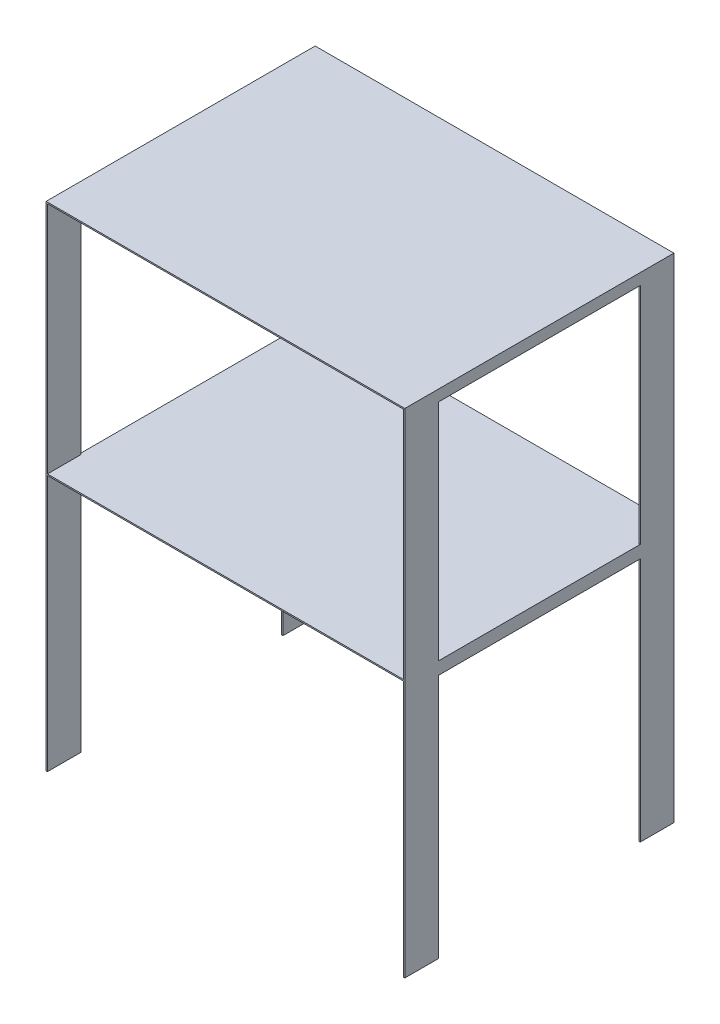
ISO-10303-21;
HEADER;
FILE_DESCRIPTION(('STEP AP214'),'2;1');
FILE_NAME('part.step','',(''),(''),'','','');
FILE_SCHEMA(('AUTOMOTIVE_DESIGN { 1 0 10303 214 1 1 1 1 }'));
ENDSEC;
DATA;
#1=APPLICATION_CONTEXT('core data for automotive mechanical design processes');
#2=APPLICATION_PROTOCOL_DEFINITION('international standard','automotive_design',2000,#1);
#3=PRODUCT_CONTEXT('',#1,'mechanical');
#4=PRODUCT('Part','Part','',(#3));
#5=PRODUCT_RELATED_PRODUCT_CATEGORY('part','',(#4));
#6=PRODUCT_DEFINITION_FORMATION('','',#4);
#7=PRODUCT_DEFINITION_CONTEXT('part definition',#1,'design');
#8=PRODUCT_DEFINITION('design','',#6,#7);
#9=PRODUCT_DEFINITION_SHAPE('','',#8);
#10=(LENGTH_UNIT() NAMED_UNIT(*) SI_UNIT(.MILLI.,.METRE.));
#11=(NAMED_UNIT(*) PLANE_ANGLE_UNIT() SI_UNIT($,.RADIAN.));
#12=(NAMED_UNIT(*) SI_UNIT($,.STERADIAN.) SOLID_ANGLE_UNIT());
#13=UNCERTAINTY_MEASURE_WITH_UNIT(LENGTH_MEASURE(1.E-05),#10,'distance_accuracy_value','');
#14=(GEOMETRIC_REPRESENTATION_CONTEXT(3) GLOBAL_UNCERTAINTY_ASSIGNED_CONTEXT((#13)) GLOBAL_UNIT_ASSIGNED_CONTEXT((#10,
#11,#12)) REPRESENTATION_CONTEXT('',''));
#15=CARTESIAN_POINT('',(0.,0.,0.));
#16=DIRECTION('',(0.,0.,1.));
#17=DIRECTION('',(1.,0.,0.));
#18=AXIS2_PLACEMENT_3D('',#15,#16,#17);
#19=CARTESIAN_POINT('',(-160.,440.,-120.));
#20=DIRECTION('',(0.,0.,1.));
#21=DIRECTION('',(1.,0.,0.));
#22=AXIS2_PLACEMENT_3D('',#19,#20,#21);
#23=PLANE('',#22);
#24=DIRECTION('',(-1.,0.,0.));
#25=VECTOR('',#24,1.);
#26=CARTESIAN_POINT('',(158.8,440.,-120.));
#27=LINE('',#26,#25);
#28=CARTESIAN_POINT('',(158.8,440.,-120.));
#29=VERTEX_POINT('',#28);
#30=CARTESIAN_POINT('',(-158.8,440.,-120.));
#31=VERTEX_POINT('',#30);
#32=EDGE_CURVE('E467',#29,#31,#27,.T.);
#33=ORIENTED_EDGE('',*,*,#32,.T.);
#34=DIRECTION('',(0.,-1.,0.));
#35=VECTOR('',#34,1.);
#36=CARTESIAN_POINT('',(-158.8,431.2,-120.));
#37=LINE('',#36,#35);
#38=CARTESIAN_POINT('',(-158.8,231.2,-120.));
#39=VERTEX_POINT('',#38);
#40=EDGE_CURVE('E388',#31,#39,#37,.T.);
#41=ORIENTED_EDGE('',*,*,#40,.T.);
#42=DIRECTION('',(1.,0.,0.));
#43=VECTOR('',#42,1.);
#44=CARTESIAN_POINT('',(-158.8,231.2,-120.));
#45=LINE('',#44,#43);
#46=CARTESIAN_POINT('',(158.8,231.2,-120.));
#47=VERTEX_POINT('',#46);
#48=EDGE_CURVE('E357',#39,#47,#45,.T.);
#49=ORIENTED_EDGE('',*,*,#48,.T.);
#50=DIRECTION('',(0.,-1.,0.));
#51=VECTOR('',#50,1.);
#52=CARTESIAN_POINT('',(158.8,431.2,-120.));
#53=LINE('',#52,#51);
#54=EDGE_CURVE('E385',#29,#47,#53,.T.);
#55=ORIENTED_EDGE('',*,*,#54,.F.);
#56=EDGE_LOOP('',(#33,#41,#49,#55));
#57=FACE_BOUND('',#56,.T.);
#58=DIRECTION('',(1.,0.,0.));
#59=VECTOR('',#58,1.);
#60=CARTESIAN_POINT('',(-160.,1.19999999999998,-120.));
#61=LINE('',#60,#59);
#62=CARTESIAN_POINT('',(-160.,1.19999999999998,-120.));
#63=VERTEX_POINT('',#62);
#64=CARTESIAN_POINT('',(-158.8,1.20000000000001,-120.));
#65=VERTEX_POINT('',#64);
#66=EDGE_CURVE('E455',#63,#65,#61,.T.);
#67=ORIENTED_EDGE('',*,*,#66,.F.);
#68=DIRECTION('',(0.,-1.,0.));
#69=VECTOR('',#68,1.);
#70=CARTESIAN_POINT('',(-160.,440.,-120.));
#71=LINE('',#70,#69);
#72=CARTESIAN_POINT('',(-160.,441.2,-120.));
#73=VERTEX_POINT('',#72);
#74=EDGE_CURVE('E285',#73,#63,#71,.T.);
#75=ORIENTED_EDGE('',*,*,#74,.F.);
#76=DIRECTION('',(-1.,0.,0.));
#77=VECTOR('',#76,1.);
#78=CARTESIAN_POINT('',(-160.,441.2,-120.));
#79=LINE('',#78,#77);
#80=CARTESIAN_POINT('',(160.,441.2,-120.));
#81=VERTEX_POINT('',#80);
#82=EDGE_CURVE('E418',#81,#73,#79,.T.);
#83=ORIENTED_EDGE('',*,*,#82,.F.);
#84=DIRECTION('',(0.,-1.,0.));
#85=VECTOR('',#84,1.);
#86=CARTESIAN_POINT('',(160.,440.,-120.));
#87=LINE('',#86,#85);
#88=CARTESIAN_POINT('',(160.,1.19999999999998,-120.));
#89=VERTEX_POINT('',#88);
#90=EDGE_CURVE('E288',#81,#89,#87,.T.);
#91=ORIENTED_EDGE('',*,*,#90,.T.);
#92=CARTESIAN_POINT('',(158.8,1.20000000000001,-120.));
#93=VERTEX_POINT('',#92);
#94=EDGE_CURVE('E458',#93,#89,#61,.T.);
#95=ORIENTED_EDGE('',*,*,#94,.F.);
#96=DIRECTION('',(0.,-1.,0.));
#97=VECTOR('',#96,1.);
#98=CARTESIAN_POINT('',(158.8,220.,-120.));
#99=LINE('',#98,#97);
#100=CARTESIAN_POINT('',(158.8,230.,-120.));
#101=VERTEX_POINT('',#100);
#102=EDGE_CURVE('E261',#101,#93,#99,.T.);
#103=ORIENTED_EDGE('',*,*,#102,.F.);
#104=DIRECTION('',(1.,0.,0.));
#105=VECTOR('',#104,1.);
#106=CARTESIAN_POINT('',(158.8,230.,-120.));
#107=LINE('',#106,#105);
#108=CARTESIAN_POINT('',(-158.8,230.,-120.));
#109=VERTEX_POINT('',#108);
#110=EDGE_CURVE('E406',#109,#101,#107,.T.);
#111=ORIENTED_EDGE('',*,*,#110,.F.);
#112=DIRECTION('',(0.,-1.,0.));
#113=VECTOR('',#112,1.);
#114=CARTESIAN_POINT('',(-158.8,220.,-120.));
#115=LINE('',#114,#113);
#116=EDGE_CURVE('E258',#109,#65,#115,.T.);
#117=ORIENTED_EDGE('',*,*,#116,.T.);
#118=EDGE_LOOP('',(#67,#75,#83,#91,#95,#103,#111,#117));
#119=FACE_BOUND('',#118,.T.);
#120=ADVANCED_FACE('F41',(#57,#119),#23,.F.);
#121=CARTESIAN_POINT('',(-160.,440.,120.));
#122=DIRECTION('',(0.,0.,-1.));
#123=DIRECTION('',(-1.,0.,0.));
#124=AXIS2_PLACEMENT_3D('',#121,#122,#123);
#125=PLANE('',#124);
#126=DIRECTION('',(0.,-1.,0.));
#127=VECTOR('',#126,1.);
#128=CARTESIAN_POINT('',(-158.8,431.2,120.));
#129=LINE('',#128,#127);
#130=CARTESIAN_POINT('',(-158.8,440.,120.));
#131=VERTEX_POINT('',#130);
#132=CARTESIAN_POINT('',(-158.8,231.2,120.));
#133=VERTEX_POINT('',#132);
#134=EDGE_CURVE('E318',#131,#133,#129,.T.);
#135=ORIENTED_EDGE('',*,*,#134,.F.);
#136=DIRECTION('',(1.,0.,0.));
#137=VECTOR('',#136,1.);
#138=CARTESIAN_POINT('',(-158.8,440.,120.));
#139=LINE('',#138,#137);
#140=CARTESIAN_POINT('',(158.8,440.,120.));
#141=VERTEX_POINT('',#140);
#142=EDGE_CURVE('E472',#131,#141,#139,.T.);
#143=ORIENTED_EDGE('',*,*,#142,.T.);
#144=DIRECTION('',(0.,-1.,0.));
#145=VECTOR('',#144,1.);
#146=CARTESIAN_POINT('',(158.8,431.2,120.));
#147=LINE('',#146,#145);
#148=CARTESIAN_POINT('',(158.8,231.2,120.));
#149=VERTEX_POINT('',#148);
#150=EDGE_CURVE('E371',#141,#149,#147,.T.);
#151=ORIENTED_EDGE('',*,*,#150,.T.);
#152=DIRECTION('',(-1.,0.,0.));
#153=VECTOR('',#152,1.);
#154=CARTESIAN_POINT('',(158.8,231.2,120.));
#155=LINE('',#154,#153);
#156=EDGE_CURVE('E343',#149,#133,#155,.T.);
#157=ORIENTED_EDGE('',*,*,#156,.T.);
#158=EDGE_LOOP('',(#135,#143,#151,#157));
#159=FACE_BOUND('',#158,.T.);
#160=DIRECTION('',(-1.,0.,0.));
#161=VECTOR('',#160,1.);
#162=CARTESIAN_POINT('',(-160.,1.19999999999998,120.));
#163=LINE('',#162,#161);
#164=CARTESIAN_POINT('',(160.,1.19999999999998,120.));
#165=VERTEX_POINT('',#164);
#166=CARTESIAN_POINT('',(158.8,1.20000000000001,120.));
#167=VERTEX_POINT('',#166);
#168=EDGE_CURVE('E452',#165,#167,#163,.T.);
#169=ORIENTED_EDGE('',*,*,#168,.F.);
#170=DIRECTION('',(0.,-1.,0.));
#171=VECTOR('',#170,1.);
#172=CARTESIAN_POINT('',(160.,440.,120.));
#173=LINE('',#172,#171);
#174=CARTESIAN_POINT('',(160.,441.2,120.));
#175=VERTEX_POINT('',#174);
#176=EDGE_CURVE('E279',#175,#165,#173,.T.);
#177=ORIENTED_EDGE('',*,*,#176,.F.);
#178=DIRECTION('',(1.,0.,0.));
#179=VECTOR('',#178,1.);
#180=CARTESIAN_POINT('',(-160.,441.2,120.));
#181=LINE('',#180,#179);
#182=CARTESIAN_POINT('',(-160.,441.2,120.));
#183=VERTEX_POINT('',#182);
#184=EDGE_CURVE('E412',#183,#175,#181,.T.);
#185=ORIENTED_EDGE('',*,*,#184,.F.);
#186=DIRECTION('',(0.,-1.,0.));
#187=VECTOR('',#186,1.);
#188=CARTESIAN_POINT('',(-160.,440.,120.));
#189=LINE('',#188,#187);
#190=CARTESIAN_POINT('',(-160.,1.19999999999998,120.));
#191=VERTEX_POINT('',#190);
#192=EDGE_CURVE('E282',#183,#191,#189,.T.);
#193=ORIENTED_EDGE('',*,*,#192,.T.);
#194=CARTESIAN_POINT('',(-158.8,1.20000000000001,120.));
#195=VERTEX_POINT('',#194);
#196=EDGE_CURVE('E448',#195,#191,#163,.T.);
#197=ORIENTED_EDGE('',*,*,#196,.F.);
#198=DIRECTION('',(0.,-1.,0.));
#199=VECTOR('',#198,1.);
#200=CARTESIAN_POINT('',(-158.8,220.,120.));
#201=LINE('',#200,#199);
#202=CARTESIAN_POINT('',(-158.8,230.,120.));
#203=VERTEX_POINT('',#202);
#204=EDGE_CURVE('E239',#203,#195,#201,.T.);
#205=ORIENTED_EDGE('',*,*,#204,.F.);
#206=DIRECTION('',(-1.,0.,0.));
#207=VECTOR('',#206,1.);
#208=CARTESIAN_POINT('',(-158.8,230.,120.));
#209=LINE('',#208,#207);
#210=CARTESIAN_POINT('',(158.8,230.,120.));
#211=VERTEX_POINT('',#210);
#212=EDGE_CURVE('E400',#211,#203,#209,.T.);
#213=ORIENTED_EDGE('',*,*,#212,.F.);
#214=DIRECTION('',(0.,-1.,0.));
#215=VECTOR('',#214,1.);
#216=CARTESIAN_POINT('',(158.8,220.,120.));
#217=LINE('',#216,#215);
#218=EDGE_CURVE('E276',#211,#167,#217,.T.);
#219=ORIENTED_EDGE('',*,*,#218,.T.);
#220=EDGE_LOOP('',(#169,#177,#185,#193,#197,#205,#213,#219));
#221=FACE_BOUND('',#220,.T.);
#222=ADVANCED_FACE('F504',(#159,#221),#125,.F.);
#223=CARTESIAN_POINT('',(160.,440.,120.));
#224=DIRECTION('',(-1.,0.,0.));
#225=DIRECTION('',(0.,0.,1.));
#226=AXIS2_PLACEMENT_3D('',#223,#224,#225);
#227=PLANE('',#226);
#228=DIRECTION('',(0.,0.,1.));
#229=VECTOR('',#228,1.);
#230=CARTESIAN_POINT('',(160.,431.2,-90.));
#231=LINE('',#230,#229);
#232=CARTESIAN_POINT('',(160.,431.2,-90.));
#233=VERTEX_POINT('',#232);
#234=CARTESIAN_POINT('',(160.,431.2,90.));
#235=VERTEX_POINT('',#234);
#236=EDGE_CURVE('E337',#233,#235,#231,.T.);
#237=ORIENTED_EDGE('',*,*,#236,.F.);
#238=DIRECTION('',(0.,-1.,0.));
#239=VECTOR('',#238,1.);
#240=CARTESIAN_POINT('',(160.,431.2,-90.));
#241=LINE('',#240,#239);
#242=CARTESIAN_POINT('',(160.,231.2,-90.));
#243=VERTEX_POINT('',#242);
#244=EDGE_CURVE('E380',#233,#243,#241,.T.);
#245=ORIENTED_EDGE('',*,*,#244,.T.);
#246=DIRECTION('',(0.,0.,1.));
#247=VECTOR('',#246,1.);
#248=CARTESIAN_POINT('',(160.,231.2,-90.));
#249=LINE('',#248,#247);
#250=CARTESIAN_POINT('',(160.,231.2,90.));
#251=VERTEX_POINT('',#250);
#252=EDGE_CURVE('E366',#243,#251,#249,.T.);
#253=ORIENTED_EDGE('',*,*,#252,.T.);
#254=DIRECTION('',(0.,-1.,0.));
#255=VECTOR('',#254,1.);
#256=CARTESIAN_POINT('',(160.,431.2,90.));
#257=LINE('',#256,#255);
#258=EDGE_CURVE('E377',#235,#251,#257,.T.);
#259=ORIENTED_EDGE('',*,*,#258,.F.);
#260=EDGE_LOOP('',(#237,#245,#253,#259));
#261=FACE_BOUND('',#260,.T.);
#262=DIRECTION('',(0.,0.,1.));
#263=VECTOR('',#262,1.);
#264=CARTESIAN_POINT('',(160.,1.19999999999998,120.));
#265=LINE('',#264,#263);
#266=CARTESIAN_POINT('',(160.,1.20000000000001,-90.));
#267=VERTEX_POINT('',#266);
#268=EDGE_CURVE('E64',#89,#267,#265,.T.);
#269=ORIENTED_EDGE('',*,*,#268,.F.);
#270=ORIENTED_EDGE('',*,*,#90,.F.);
#271=DIRECTION('',(0.,0.,-1.));
#272=VECTOR('',#271,1.);
#273=CARTESIAN_POINT('',(160.,441.2,-120.));
#274=LINE('',#273,#272);
#275=EDGE_CURVE('E415',#175,#81,#274,.T.);
#276=ORIENTED_EDGE('',*,*,#275,.F.);
#277=ORIENTED_EDGE('',*,*,#176,.T.);
#278=CARTESIAN_POINT('',(160.,1.20000000000001,90.));
#279=VERTEX_POINT('',#278);
#280=EDGE_CURVE('E464',#279,#165,#265,.T.);
#281=ORIENTED_EDGE('',*,*,#280,.F.);
#282=DIRECTION('',(0.,-1.,0.));
#283=VECTOR('',#282,1.);
#284=CARTESIAN_POINT('',(160.,220.,90.));
#285=LINE('',#284,#283);
#286=CARTESIAN_POINT('',(160.,220.,90.));
#287=VERTEX_POINT('',#286);
#288=EDGE_CURVE('E270',#287,#279,#285,.T.);
#289=ORIENTED_EDGE('',*,*,#288,.F.);
#290=DIRECTION('',(0.,0.,-1.));
#291=VECTOR('',#290,1.);
#292=CARTESIAN_POINT('',(160.,220.,90.));
#293=LINE('',#292,#291);
#294=CARTESIAN_POINT('',(160.,220.,-90.));
#295=VERTEX_POINT('',#294);
#296=EDGE_CURVE('E423',#287,#295,#293,.T.);
#297=ORIENTED_EDGE('',*,*,#296,.T.);
#298=DIRECTION('',(0.,-1.,0.));
#299=VECTOR('',#298,1.);
#300=CARTESIAN_POINT('',(160.,220.,-90.));
#301=LINE('',#300,#299);
#302=EDGE_CURVE('E267',#295,#267,#301,.T.);
#303=ORIENTED_EDGE('',*,*,#302,.T.);
#304=EDGE_LOOP('',(#269,#270,#276,#277,#281,#289,#297,#303));
#305=FACE_BOUND('',#304,.T.);
#306=ADVANCED_FACE('F43',(#261,#305),#227,.F.);
#307=CARTESIAN_POINT('',(-160.,440.,120.));
#308=DIRECTION('',(1.,0.,0.));
#309=DIRECTION('',(0.,0.,-1.));
#310=AXIS2_PLACEMENT_3D('',#307,#308,#309);
#311=PLANE('',#310);
#312=DIRECTION('',(0.,0.,-1.));
#313=VECTOR('',#312,1.);
#314=CARTESIAN_POINT('',(-160.,431.2,90.));
#315=LINE('',#314,#313);
#316=CARTESIAN_POINT('',(-160.,431.2,90.));
#317=VERTEX_POINT('',#316);
#318=CARTESIAN_POINT('',(-160.,431.2,-90.));
#319=VERTEX_POINT('',#318);
#320=EDGE_CURVE('E322',#317,#319,#315,.T.);
#321=ORIENTED_EDGE('',*,*,#320,.F.);
#322=DIRECTION('',(0.,-1.,0.));
#323=VECTOR('',#322,1.);
#324=CARTESIAN_POINT('',(-160.,431.2,90.));
#325=LINE('',#324,#323);
#326=CARTESIAN_POINT('',(-160.,231.2,90.));
#327=VERTEX_POINT('',#326);
#328=EDGE_CURVE('E317',#317,#327,#325,.T.);
#329=ORIENTED_EDGE('',*,*,#328,.T.);
#330=DIRECTION('',(0.,0.,-1.));
#331=VECTOR('',#330,1.);
#332=CARTESIAN_POINT('',(-160.,231.2,90.));
#333=LINE('',#332,#331);
#334=CARTESIAN_POINT('',(-160.,231.2,-90.));
#335=VERTEX_POINT('',#334);
#336=EDGE_CURVE('E349',#327,#335,#333,.T.);
#337=ORIENTED_EDGE('',*,*,#336,.T.);
#338=DIRECTION('',(0.,-1.,0.));
#339=VECTOR('',#338,1.);
#340=CARTESIAN_POINT('',(-160.,431.2,-90.));
#341=LINE('',#340,#339);
#342=EDGE_CURVE('E393',#319,#335,#341,.T.);
#343=ORIENTED_EDGE('',*,*,#342,.F.);
#344=EDGE_LOOP('',(#321,#329,#337,#343));
#345=FACE_BOUND('',#344,.T.);
#346=DIRECTION('',(0.,0.,-1.));
#347=VECTOR('',#346,1.);
#348=CARTESIAN_POINT('',(-160.,1.19999999999998,120.));
#349=LINE('',#348,#347);
#350=CARTESIAN_POINT('',(-160.,1.20000000000001,90.));
#351=VERTEX_POINT('',#350);
#352=EDGE_CURVE('E229',#191,#351,#349,.T.);
#353=ORIENTED_EDGE('',*,*,#352,.F.);
#354=ORIENTED_EDGE('',*,*,#192,.F.);
#355=DIRECTION('',(0.,0.,1.));
#356=VECTOR('',#355,1.);
#357=CARTESIAN_POINT('',(-160.,441.2,-120.));
#358=LINE('',#357,#356);
#359=EDGE_CURVE('E409',#73,#183,#358,.T.);
#360=ORIENTED_EDGE('',*,*,#359,.F.);
#361=ORIENTED_EDGE('',*,*,#74,.T.);
#362=CARTESIAN_POINT('',(-160.,1.20000000000001,-90.));
#363=VERTEX_POINT('',#362);
#364=EDGE_CURVE('E450',#363,#63,#349,.T.);
#365=ORIENTED_EDGE('',*,*,#364,.F.);
#366=DIRECTION('',(0.,-1.,0.));
#367=VECTOR('',#366,1.);
#368=CARTESIAN_POINT('',(-160.,220.,-90.));
#369=LINE('',#368,#367);
#370=CARTESIAN_POINT('',(-160.,220.,-90.));
#371=VERTEX_POINT('',#370);
#372=EDGE_CURVE('E248',#371,#363,#369,.T.);
#373=ORIENTED_EDGE('',*,*,#372,.F.);
#374=DIRECTION('',(0.,0.,1.));
#375=VECTOR('',#374,1.);
#376=CARTESIAN_POINT('',(-160.,220.,90.));
#377=LINE('',#376,#375);
#378=CARTESIAN_POINT('',(-160.,220.,90.));
#379=VERTEX_POINT('',#378);
#380=EDGE_CURVE('E431',#371,#379,#377,.T.);
#381=ORIENTED_EDGE('',*,*,#380,.T.);
#382=DIRECTION('',(0.,-1.,0.));
#383=VECTOR('',#382,1.);
#384=CARTESIAN_POINT('',(-160.,220.,90.));
#385=LINE('',#384,#383);
#386=EDGE_CURVE('E246',#379,#351,#385,.T.);
#387=ORIENTED_EDGE('',*,*,#386,.T.);
#388=EDGE_LOOP('',(#353,#354,#360,#361,#365,#373,#381,#387));
#389=FACE_BOUND('',#388,.T.);
#390=ADVANCED_FACE('F436',(#345,#389),#311,.F.);
#391=CARTESIAN_POINT('',(158.8,220.,120.));
#392=DIRECTION('',(-1.,0.,0.));
#393=DIRECTION('',(0.,0.,1.));
#394=AXIS2_PLACEMENT_3D('',#391,#392,#393);
#395=PLANE('',#394);
#396=ORIENTED_EDGE('',*,*,#102,.T.);
#397=DIRECTION('',(0.,0.,1.));
#398=VECTOR('',#397,1.);
#399=CARTESIAN_POINT('',(158.8,1.20000000000001,120.));
#400=LINE('',#399,#398);
#401=CARTESIAN_POINT('',(158.8,1.20000000000001,-90.));
#402=VERTEX_POINT('',#401);
#403=EDGE_CURVE('E460',#93,#402,#400,.T.);
#404=ORIENTED_EDGE('',*,*,#403,.T.);
#405=DIRECTION('',(0.,-1.,0.));
#406=VECTOR('',#405,1.);
#407=CARTESIAN_POINT('',(158.8,220.,-90.));
#408=LINE('',#407,#406);
#409=CARTESIAN_POINT('',(158.8,220.,-90.));
#410=VERTEX_POINT('',#409);
#411=EDGE_CURVE('E264',#410,#402,#408,.T.);
#412=ORIENTED_EDGE('',*,*,#411,.F.);
#413=DIRECTION('',(0.,0.,-1.));
#414=VECTOR('',#413,1.);
#415=CARTESIAN_POINT('',(158.8,220.,0.));
#416=LINE('',#415,#414);
#417=CARTESIAN_POINT('',(158.8,220.,90.));
#418=VERTEX_POINT('',#417);
#419=EDGE_CURVE('E293',#418,#410,#416,.T.);
#420=ORIENTED_EDGE('',*,*,#419,.F.);
#421=DIRECTION('',(0.,-1.,0.));
#422=VECTOR('',#421,1.);
#423=CARTESIAN_POINT('',(158.8,220.,90.));
#424=LINE('',#423,#422);
#425=CARTESIAN_POINT('',(158.8,1.20000000000001,90.));
#426=VERTEX_POINT('',#425);
#427=EDGE_CURVE('E273',#418,#426,#424,.T.);
#428=ORIENTED_EDGE('',*,*,#427,.T.);
#429=EDGE_CURVE('E56',#426,#167,#400,.T.);
#430=ORIENTED_EDGE('',*,*,#429,.T.);
#431=ORIENTED_EDGE('',*,*,#218,.F.);
#432=DIRECTION('',(0.,0.,1.));
#433=VECTOR('',#432,1.);
#434=CARTESIAN_POINT('',(158.8,230.,120.));
#435=LINE('',#434,#433);
#436=EDGE_CURVE('E374',#101,#211,#435,.T.);
#437=ORIENTED_EDGE('',*,*,#436,.F.);
#438=EDGE_LOOP('',(#396,#404,#412,#420,#428,#430,#431,#437));
#439=FACE_BOUND('',#438,.T.);
#440=ADVANCED_FACE('F495',(#439),#395,.T.);
#441=CARTESIAN_POINT('',(158.8,220.,90.));
#442=DIRECTION('',(0.,0.,-1.));
#443=DIRECTION('',(-1.,0.,0.));
#444=AXIS2_PLACEMENT_3D('',#441,#442,#443);
#445=PLANE('',#444);
#446=ORIENTED_EDGE('',*,*,#288,.T.);
#447=DIRECTION('',(-1.,0.,0.));
#448=VECTOR('',#447,1.);
#449=CARTESIAN_POINT('',(158.8,1.20000000000001,90.));
#450=LINE('',#449,#448);
#451=EDGE_CURVE('E465',#279,#426,#450,.T.);
#452=ORIENTED_EDGE('',*,*,#451,.T.);
#453=ORIENTED_EDGE('',*,*,#427,.F.);
#454=DIRECTION('',(1.,0.,0.));
#455=VECTOR('',#454,1.);
#456=CARTESIAN_POINT('',(158.8,220.,90.));
#457=LINE('',#456,#455);
#458=EDGE_CURVE('E421',#418,#287,#457,.T.);
#459=ORIENTED_EDGE('',*,*,#458,.T.);
#460=EDGE_LOOP('',(#446,#452,#453,#459));
#461=FACE_BOUND('',#460,.T.);
#462=ADVANCED_FACE('F501',(#461),#445,.T.);
#463=CARTESIAN_POINT('',(160.,220.,-90.));
#464=DIRECTION('',(0.,0.,1.));
#465=DIRECTION('',(1.,0.,0.));
#466=AXIS2_PLACEMENT_3D('',#463,#464,#465);
#467=PLANE('',#466);
#468=ORIENTED_EDGE('',*,*,#411,.T.);
#469=DIRECTION('',(1.,0.,0.));
#470=VECTOR('',#469,1.);
#471=CARTESIAN_POINT('',(160.,1.20000000000001,-90.));
#472=LINE('',#471,#470);
#473=EDGE_CURVE('E457',#402,#267,#472,.T.);
#474=ORIENTED_EDGE('',*,*,#473,.T.);
#475=ORIENTED_EDGE('',*,*,#302,.F.);
#476=DIRECTION('',(-1.,0.,0.));
#477=VECTOR('',#476,1.);
#478=CARTESIAN_POINT('',(160.,220.,-90.));
#479=LINE('',#478,#477);
#480=EDGE_CURVE('E426',#295,#410,#479,.T.);
#481=ORIENTED_EDGE('',*,*,#480,.T.);
#482=EDGE_LOOP('',(#468,#474,#475,#481));
#483=FACE_BOUND('',#482,.T.);
#484=ADVANCED_FACE('F517',(#483),#467,.T.);
#485=CARTESIAN_POINT('',(-158.8,220.,-90.));
#486=DIRECTION('',(1.,0.,0.));
#487=DIRECTION('',(0.,0.,-1.));
#488=AXIS2_PLACEMENT_3D('',#485,#486,#487);
#489=PLANE('',#488);
#490=ORIENTED_EDGE('',*,*,#204,.T.);
#491=DIRECTION('',(0.,0.,-1.));
#492=VECTOR('',#491,1.);
#493=CARTESIAN_POINT('',(-158.8,1.20000000000001,-90.));
#494=LINE('',#493,#492);
#495=CARTESIAN_POINT('',(-158.8,1.20000000000001,90.));
#496=VERTEX_POINT('',#495);
#497=EDGE_CURVE('E226',#195,#496,#494,.T.);
#498=ORIENTED_EDGE('',*,*,#497,.T.);
#499=DIRECTION('',(0.,-1.,0.));
#500=VECTOR('',#499,1.);
#501=CARTESIAN_POINT('',(-158.8,220.,90.));
#502=LINE('',#501,#500);
#503=CARTESIAN_POINT('',(-158.8,220.,90.));
#504=VERTEX_POINT('',#503);
#505=EDGE_CURVE('E237',#504,#496,#502,.T.);
#506=ORIENTED_EDGE('',*,*,#505,.F.);
#507=DIRECTION('',(0.,0.,1.));
#508=VECTOR('',#507,1.);
#509=CARTESIAN_POINT('',(-158.8,220.,0.));
#510=LINE('',#509,#508);
#511=CARTESIAN_POINT('',(-158.8,220.,-90.));
#512=VERTEX_POINT('',#511);
#513=EDGE_CURVE('E291',#512,#504,#510,.T.);
#514=ORIENTED_EDGE('',*,*,#513,.F.);
#515=DIRECTION('',(0.,-1.,0.));
#516=VECTOR('',#515,1.);
#517=CARTESIAN_POINT('',(-158.8,220.,-90.));
#518=LINE('',#517,#516);
#519=CARTESIAN_POINT('',(-158.8,1.20000000000001,-90.));
#520=VERTEX_POINT('',#519);
#521=EDGE_CURVE('E255',#512,#520,#518,.T.);
#522=ORIENTED_EDGE('',*,*,#521,.T.);
#523=EDGE_CURVE('E241',#520,#65,#494,.T.);
#524=ORIENTED_EDGE('',*,*,#523,.T.);
#525=ORIENTED_EDGE('',*,*,#116,.F.);
#526=DIRECTION('',(0.,0.,-1.));
#527=VECTOR('',#526,1.);
#528=CARTESIAN_POINT('',(-158.8,230.,-120.));
#529=LINE('',#528,#527);
#530=EDGE_CURVE('E403',#203,#109,#529,.T.);
#531=ORIENTED_EDGE('',*,*,#530,.F.);
#532=EDGE_LOOP('',(#490,#498,#506,#514,#522,#524,#525,#531));
#533=FACE_BOUND('',#532,.T.);
#534=ADVANCED_FACE('F236',(#533),#489,.T.);
#535=CARTESIAN_POINT('',(-159.99948150289,220.,-90.));
#536=DIRECTION('',(0.,0.,1.));
#537=DIRECTION('',(1.,0.,0.));
#538=AXIS2_PLACEMENT_3D('',#535,#536,#537);
#539=PLANE('',#538);
#540=ORIENTED_EDGE('',*,*,#372,.T.);
#541=DIRECTION('',(1.,0.,0.));
#542=VECTOR('',#541,1.);
#543=CARTESIAN_POINT('',(-159.99948150289,1.20000000000001,-90.));
#544=LINE('',#543,#542);
#545=EDGE_CURVE('E446',#363,#520,#544,.T.);
#546=ORIENTED_EDGE('',*,*,#545,.T.);
#547=ORIENTED_EDGE('',*,*,#521,.F.);
#548=DIRECTION('',(-1.,0.,0.));
#549=VECTOR('',#548,1.);
#550=CARTESIAN_POINT('',(-159.99948150289,220.,-90.));
#551=LINE('',#550,#549);
#552=EDGE_CURVE('E429',#512,#371,#551,.T.);
#553=ORIENTED_EDGE('',*,*,#552,.T.);
#554=EDGE_LOOP('',(#540,#546,#547,#553));
#555=FACE_BOUND('',#554,.T.);
#556=ADVANCED_FACE('F445',(#555),#539,.T.);
#557=CARTESIAN_POINT('',(-160.,220.,90.));
#558=DIRECTION('',(0.,0.,-1.));
#559=DIRECTION('',(-1.,0.,0.));
#560=AXIS2_PLACEMENT_3D('',#557,#558,#559);
#561=PLANE('',#560);
#562=ORIENTED_EDGE('',*,*,#505,.T.);
#563=DIRECTION('',(-1.,0.,0.));
#564=VECTOR('',#563,1.);
#565=CARTESIAN_POINT('',(-160.,1.20000000000001,90.));
#566=LINE('',#565,#564);
#567=EDGE_CURVE('E11',#496,#351,#566,.T.);
#568=ORIENTED_EDGE('',*,*,#567,.T.);
#569=ORIENTED_EDGE('',*,*,#386,.F.);
#570=DIRECTION('',(1.,0.,0.));
#571=VECTOR('',#570,1.);
#572=CARTESIAN_POINT('',(-160.,220.,90.));
#573=LINE('',#572,#571);
#574=EDGE_CURVE('E245',#379,#504,#573,.T.);
#575=ORIENTED_EDGE('',*,*,#574,.T.);
#576=EDGE_LOOP('',(#562,#568,#569,#575));
#577=FACE_BOUND('',#576,.T.);
#578=ADVANCED_FACE('F243',(#577),#561,.T.);
#579=CARTESIAN_POINT('',(0.,431.2,0.));
#580=DIRECTION('',(0.,-1.,0.));
#581=DIRECTION('',(0.,0.,-1.));
#582=AXIS2_PLACEMENT_3D('',#579,#580,#581);
#583=PLANE('',#582);
#584=DIRECTION('',(1.,0.,0.));
#585=VECTOR('',#584,1.);
#586=CARTESIAN_POINT('',(-160.,431.2,-90.));
#587=LINE('',#586,#585);
#588=CARTESIAN_POINT('',(-158.8,431.2,-90.));
#589=VERTEX_POINT('',#588);
#590=EDGE_CURVE('E305',#319,#589,#587,.T.);
#591=ORIENTED_EDGE('',*,*,#590,.T.);
#592=DIRECTION('',(0.,0.,1.));
#593=VECTOR('',#592,1.);
#594=CARTESIAN_POINT('',(-158.8,431.2,0.));
#595=LINE('',#594,#593);
#596=CARTESIAN_POINT('',(-158.8,431.2,90.));
#597=VERTEX_POINT('',#596);
#598=EDGE_CURVE('E49',#589,#597,#595,.T.);
#599=ORIENTED_EDGE('',*,*,#598,.T.);
#600=DIRECTION('',(-1.,0.,0.));
#601=VECTOR('',#600,1.);
#602=CARTESIAN_POINT('',(-158.8,431.2,90.));
#603=LINE('',#602,#601);
#604=EDGE_CURVE('E303',#597,#317,#603,.T.);
#605=ORIENTED_EDGE('',*,*,#604,.T.);
#606=ORIENTED_EDGE('',*,*,#320,.T.);
#607=EDGE_LOOP('',(#591,#599,#605,#606));
#608=FACE_BOUND('',#607,.T.);
#609=ADVANCED_FACE('F300',(#608),#583,.T.);
#610=DIRECTION('',(-1.,0.,0.));
#611=VECTOR('',#610,1.);
#612=CARTESIAN_POINT('',(160.,431.2,90.));
#613=LINE('',#612,#611);
#614=CARTESIAN_POINT('',(158.8,431.2,90.));
#615=VERTEX_POINT('',#614);
#616=EDGE_CURVE('E340',#235,#615,#613,.T.);
#617=ORIENTED_EDGE('',*,*,#616,.T.);
#618=DIRECTION('',(0.,0.,-1.));
#619=VECTOR('',#618,1.);
#620=CARTESIAN_POINT('',(158.8,431.2,0.));
#621=LINE('',#620,#619);
#622=CARTESIAN_POINT('',(158.8,431.2,-90.));
#623=VERTEX_POINT('',#622);
#624=EDGE_CURVE('E295',#615,#623,#621,.T.);
#625=ORIENTED_EDGE('',*,*,#624,.T.);
#626=DIRECTION('',(1.,0.,0.));
#627=VECTOR('',#626,1.);
#628=CARTESIAN_POINT('',(158.8,431.2,-90.));
#629=LINE('',#628,#627);
#630=EDGE_CURVE('E334',#623,#233,#629,.T.);
#631=ORIENTED_EDGE('',*,*,#630,.T.);
#632=ORIENTED_EDGE('',*,*,#236,.T.);
#633=EDGE_LOOP('',(#617,#625,#631,#632));
#634=FACE_BOUND('',#633,.T.);
#635=ADVANCED_FACE('F559',(#634),#583,.T.);
#636=CARTESIAN_POINT('',(0.,220.,0.));
#637=DIRECTION('',(0.,1.,0.));
#638=DIRECTION('',(0.,0.,1.));
#639=AXIS2_PLACEMENT_3D('',#636,#637,#638);
#640=PLANE('',#639);
#641=ORIENTED_EDGE('',*,*,#458,.F.);
#642=ORIENTED_EDGE('',*,*,#419,.T.);
#643=ORIENTED_EDGE('',*,*,#480,.F.);
#644=ORIENTED_EDGE('',*,*,#296,.F.);
#645=EDGE_LOOP('',(#641,#642,#643,#644));
#646=FACE_BOUND('',#645,.T.);
#647=ADVANCED_FACE('F531',(#646),#640,.F.);
#648=ORIENTED_EDGE('',*,*,#552,.F.);
#649=ORIENTED_EDGE('',*,*,#513,.T.);
#650=ORIENTED_EDGE('',*,*,#574,.F.);
#651=ORIENTED_EDGE('',*,*,#380,.F.);
#652=EDGE_LOOP('',(#648,#649,#650,#651));
#653=FACE_BOUND('',#652,.T.);
#654=ADVANCED_FACE('F440',(#653),#640,.F.);
#655=CARTESIAN_POINT('',(0.,441.2,0.));
#656=DIRECTION('',(0.,1.,0.));
#657=DIRECTION('',(0.,0.,1.));
#658=AXIS2_PLACEMENT_3D('',#655,#656,#657);
#659=PLANE('',#658);
#660=ORIENTED_EDGE('',*,*,#359,.T.);
#661=ORIENTED_EDGE('',*,*,#184,.T.);
#662=ORIENTED_EDGE('',*,*,#275,.T.);
#663=ORIENTED_EDGE('',*,*,#82,.T.);
#664=EDGE_LOOP('',(#660,#661,#662,#663));
#665=FACE_BOUND('',#664,.T.);
#666=ADVANCED_FACE('F530',(#665),#659,.T.);
#667=CARTESIAN_POINT('',(0.,230.,0.));
#668=DIRECTION('',(0.,1.,0.));
#669=DIRECTION('',(0.,0.,1.));
#670=AXIS2_PLACEMENT_3D('',#667,#668,#669);
#671=PLANE('',#670);
#672=ORIENTED_EDGE('',*,*,#436,.T.);
#673=ORIENTED_EDGE('',*,*,#212,.T.);
#674=ORIENTED_EDGE('',*,*,#530,.T.);
#675=ORIENTED_EDGE('',*,*,#110,.T.);
#676=EDGE_LOOP('',(#672,#673,#674,#675));
#677=FACE_BOUND('',#676,.T.);
#678=ADVANCED_FACE('F534',(#677),#671,.F.);
#679=CARTESIAN_POINT('',(158.8,431.2,90.));
#680=DIRECTION('',(1.,0.,0.));
#681=DIRECTION('',(0.,0.,-1.));
#682=AXIS2_PLACEMENT_3D('',#679,#680,#681);
#683=PLANE('',#682);
#684=DIRECTION('',(0.,0.,1.));
#685=VECTOR('',#684,1.);
#686=CARTESIAN_POINT('',(158.8,231.2,90.));
#687=LINE('',#686,#685);
#688=CARTESIAN_POINT('',(158.8,231.2,90.));
#689=VERTEX_POINT('',#688);
#690=EDGE_CURVE('E323',#689,#149,#687,.T.);
#691=ORIENTED_EDGE('',*,*,#690,.T.);
#692=ORIENTED_EDGE('',*,*,#150,.F.);
#693=DIRECTION('',(0.,0.,-1.));
#694=VECTOR('',#693,1.);
#695=CARTESIAN_POINT('',(158.8,440.,120.));
#696=LINE('',#695,#694);
#697=EDGE_CURVE('E330',#141,#29,#696,.T.);
#698=ORIENTED_EDGE('',*,*,#697,.T.);
#699=ORIENTED_EDGE('',*,*,#54,.T.);
#700=DIRECTION('',(0.,0.,1.));
#701=VECTOR('',#700,1.);
#702=CARTESIAN_POINT('',(158.8,231.2,-120.));
#703=LINE('',#702,#701);
#704=CARTESIAN_POINT('',(158.8,231.2,-90.));
#705=VERTEX_POINT('',#704);
#706=EDGE_CURVE('E360',#47,#705,#703,.T.);
#707=ORIENTED_EDGE('',*,*,#706,.T.);
#708=DIRECTION('',(0.,-1.,0.));
#709=VECTOR('',#708,1.);
#710=CARTESIAN_POINT('',(158.8,431.2,-90.));
#711=LINE('',#710,#709);
#712=EDGE_CURVE('E383',#623,#705,#711,.T.);
#713=ORIENTED_EDGE('',*,*,#712,.F.);
#714=ORIENTED_EDGE('',*,*,#624,.F.);
#715=DIRECTION('',(0.,-1.,0.));
#716=VECTOR('',#715,1.);
#717=CARTESIAN_POINT('',(158.8,431.2,90.));
#718=LINE('',#717,#716);
#719=EDGE_CURVE('E375',#615,#689,#718,.T.);
#720=ORIENTED_EDGE('',*,*,#719,.T.);
#721=EDGE_LOOP('',(#691,#692,#698,#699,#707,#713,#714,#720));
#722=FACE_BOUND('',#721,.T.);
#723=ADVANCED_FACE('F480',(#722),#683,.F.);
#724=CARTESIAN_POINT('',(160.,431.2,90.));
#725=DIRECTION('',(0.,0.,1.));
#726=DIRECTION('',(1.,0.,0.));
#727=AXIS2_PLACEMENT_3D('',#724,#725,#726);
#728=PLANE('',#727);
#729=DIRECTION('',(-1.,0.,0.));
#730=VECTOR('',#729,1.);
#731=CARTESIAN_POINT('',(160.,231.2,90.));
#732=LINE('',#731,#730);
#733=EDGE_CURVE('E327',#251,#689,#732,.T.);
#734=ORIENTED_EDGE('',*,*,#733,.T.);
#735=ORIENTED_EDGE('',*,*,#719,.F.);
#736=ORIENTED_EDGE('',*,*,#616,.F.);
#737=ORIENTED_EDGE('',*,*,#258,.T.);
#738=EDGE_LOOP('',(#734,#735,#736,#737));
#739=FACE_BOUND('',#738,.T.);
#740=ADVANCED_FACE('F548',(#739),#728,.F.);
#741=CARTESIAN_POINT('',(158.8,431.2,-90.));
#742=DIRECTION('',(0.,0.,-1.));
#743=DIRECTION('',(-1.,0.,0.));
#744=AXIS2_PLACEMENT_3D('',#741,#742,#743);
#745=PLANE('',#744);
#746=DIRECTION('',(1.,0.,0.));
#747=VECTOR('',#746,1.);
#748=CARTESIAN_POINT('',(158.8,231.2,-90.));
#749=LINE('',#748,#747);
#750=EDGE_CURVE('E363',#705,#243,#749,.T.);
#751=ORIENTED_EDGE('',*,*,#750,.T.);
#752=ORIENTED_EDGE('',*,*,#244,.F.);
#753=ORIENTED_EDGE('',*,*,#630,.F.);
#754=ORIENTED_EDGE('',*,*,#712,.T.);
#755=EDGE_LOOP('',(#751,#752,#753,#754));
#756=FACE_BOUND('',#755,.T.);
#757=ADVANCED_FACE('F545',(#756),#745,.F.);
#758=CARTESIAN_POINT('',(-158.8,431.2,-90.));
#759=DIRECTION('',(-1.,0.,0.));
#760=DIRECTION('',(0.,0.,1.));
#761=AXIS2_PLACEMENT_3D('',#758,#759,#760);
#762=PLANE('',#761);
#763=DIRECTION('',(0.,0.,-1.));
#764=VECTOR('',#763,1.);
#765=CARTESIAN_POINT('',(-158.8,231.2,-90.));
#766=LINE('',#765,#764);
#767=CARTESIAN_POINT('',(-158.8,231.2,-90.));
#768=VERTEX_POINT('',#767);
#769=EDGE_CURVE('E355',#768,#39,#766,.T.);
#770=ORIENTED_EDGE('',*,*,#769,.T.);
#771=ORIENTED_EDGE('',*,*,#40,.F.);
#772=DIRECTION('',(0.,0.,1.));
#773=VECTOR('',#772,1.);
#774=CARTESIAN_POINT('',(-158.8,440.,-120.));
#775=LINE('',#774,#773);
#776=EDGE_CURVE('E470',#31,#131,#775,.T.);
#777=ORIENTED_EDGE('',*,*,#776,.T.);
#778=ORIENTED_EDGE('',*,*,#134,.T.);
#779=DIRECTION('',(0.,0.,-1.));
#780=VECTOR('',#779,1.);
#781=CARTESIAN_POINT('',(-158.8,231.2,120.));
#782=LINE('',#781,#780);
#783=CARTESIAN_POINT('',(-158.8,231.2,90.));
#784=VERTEX_POINT('',#783);
#785=EDGE_CURVE('E313',#133,#784,#782,.T.);
#786=ORIENTED_EDGE('',*,*,#785,.T.);
#787=DIRECTION('',(0.,-1.,0.));
#788=VECTOR('',#787,1.);
#789=CARTESIAN_POINT('',(-158.8,431.2,90.));
#790=LINE('',#789,#788);
#791=EDGE_CURVE('E309',#597,#784,#790,.T.);
#792=ORIENTED_EDGE('',*,*,#791,.F.);
#793=ORIENTED_EDGE('',*,*,#598,.F.);
#794=DIRECTION('',(0.,-1.,0.));
#795=VECTOR('',#794,1.);
#796=CARTESIAN_POINT('',(-158.8,431.2,-90.));
#797=LINE('',#796,#795);
#798=EDGE_CURVE('E391',#589,#768,#797,.T.);
#799=ORIENTED_EDGE('',*,*,#798,.T.);
#800=EDGE_LOOP('',(#770,#771,#777,#778,#786,#792,#793,#799));
#801=FACE_BOUND('',#800,.T.);
#802=ADVANCED_FACE('F311',(#801),#762,.F.);
#803=CARTESIAN_POINT('',(-160.,431.2,-90.));
#804=DIRECTION('',(0.,0.,-1.));
#805=DIRECTION('',(-1.,0.,0.));
#806=AXIS2_PLACEMENT_3D('',#803,#804,#805);
#807=PLANE('',#806);
#808=DIRECTION('',(1.,0.,0.));
#809=VECTOR('',#808,1.);
#810=CARTESIAN_POINT('',(-160.,231.2,-90.));
#811=LINE('',#810,#809);
#812=EDGE_CURVE('E352',#335,#768,#811,.T.);
#813=ORIENTED_EDGE('',*,*,#812,.T.);
#814=ORIENTED_EDGE('',*,*,#798,.F.);
#815=ORIENTED_EDGE('',*,*,#590,.F.);
#816=ORIENTED_EDGE('',*,*,#342,.T.);
#817=EDGE_LOOP('',(#813,#814,#815,#816));
#818=FACE_BOUND('',#817,.T.);
#819=ADVANCED_FACE('F491',(#818),#807,.F.);
#820=CARTESIAN_POINT('',(-158.8,431.2,90.));
#821=DIRECTION('',(0.,0.,1.));
#822=DIRECTION('',(1.,0.,0.));
#823=AXIS2_PLACEMENT_3D('',#820,#821,#822);
#824=PLANE('',#823);
#825=DIRECTION('',(-1.,0.,0.));
#826=VECTOR('',#825,1.);
#827=CARTESIAN_POINT('',(-158.8,231.2,90.));
#828=LINE('',#827,#826);
#829=EDGE_CURVE('E347',#784,#327,#828,.T.);
#830=ORIENTED_EDGE('',*,*,#829,.T.);
#831=ORIENTED_EDGE('',*,*,#328,.F.);
#832=ORIENTED_EDGE('',*,*,#604,.F.);
#833=ORIENTED_EDGE('',*,*,#791,.T.);
#834=EDGE_LOOP('',(#830,#831,#832,#833));
#835=FACE_BOUND('',#834,.T.);
#836=ADVANCED_FACE('F320',(#835),#824,.F.);
#837=CARTESIAN_POINT('',(0.,231.2,0.));
#838=DIRECTION('',(0.,-1.,0.));
#839=DIRECTION('',(0.,0.,-1.));
#840=AXIS2_PLACEMENT_3D('',#837,#838,#839);
#841=PLANE('',#840);
#842=ORIENTED_EDGE('',*,*,#156,.F.);
#843=ORIENTED_EDGE('',*,*,#690,.F.);
#844=ORIENTED_EDGE('',*,*,#733,.F.);
#845=ORIENTED_EDGE('',*,*,#252,.F.);
#846=ORIENTED_EDGE('',*,*,#750,.F.);
#847=ORIENTED_EDGE('',*,*,#706,.F.);
#848=ORIENTED_EDGE('',*,*,#48,.F.);
#849=ORIENTED_EDGE('',*,*,#769,.F.);
#850=ORIENTED_EDGE('',*,*,#812,.F.);
#851=ORIENTED_EDGE('',*,*,#336,.F.);
#852=ORIENTED_EDGE('',*,*,#829,.F.);
#853=ORIENTED_EDGE('',*,*,#785,.F.);
#854=EDGE_LOOP('',(#842,#843,#844,#845,#846,#847,#848,#849,#850,#851,#852,#853));
#855=FACE_BOUND('',#854,.T.);
#856=ADVANCED_FACE('F488',(#855),#841,.F.);
#857=CARTESIAN_POINT('',(0.,440.,0.));
#858=DIRECTION('',(0.,1.,0.));
#859=DIRECTION('',(0.,0.,1.));
#860=AXIS2_PLACEMENT_3D('',#857,#858,#859);
#861=PLANE('',#860);
#862=ORIENTED_EDGE('',*,*,#32,.F.);
#863=ORIENTED_EDGE('',*,*,#697,.F.);
#864=ORIENTED_EDGE('',*,*,#142,.F.);
#865=ORIENTED_EDGE('',*,*,#776,.F.);
#866=EDGE_LOOP('',(#862,#863,#864,#865));
#867=FACE_BOUND('',#866,.T.);
#868=ADVANCED_FACE('F483',(#867),#861,.F.);
#869=CARTESIAN_POINT('',(0.,1.2,0.));
#870=DIRECTION('',(0.,-1.,0.));
#871=DIRECTION('',(0.,0.,-1.));
#872=AXIS2_PLACEMENT_3D('',#869,#870,#871);
#873=PLANE('',#872);
#874=ORIENTED_EDGE('',*,*,#196,.T.);
#875=ORIENTED_EDGE('',*,*,#352,.T.);
#876=ORIENTED_EDGE('',*,*,#567,.F.);
#877=ORIENTED_EDGE('',*,*,#497,.F.);
#878=EDGE_LOOP('',(#874,#875,#876,#877));
#879=FACE_BOUND('',#878,.T.);
#880=ADVANCED_FACE('F225',(#879),#873,.T.);
#881=ORIENTED_EDGE('',*,*,#66,.T.);
#882=ORIENTED_EDGE('',*,*,#523,.F.);
#883=ORIENTED_EDGE('',*,*,#545,.F.);
#884=ORIENTED_EDGE('',*,*,#364,.T.);
#885=EDGE_LOOP('',(#881,#882,#883,#884));
#886=FACE_BOUND('',#885,.T.);
#887=ADVANCED_FACE('F568',(#886),#873,.T.);
#888=ORIENTED_EDGE('',*,*,#94,.T.);
#889=ORIENTED_EDGE('',*,*,#268,.T.);
#890=ORIENTED_EDGE('',*,*,#473,.F.);
#891=ORIENTED_EDGE('',*,*,#403,.F.);
#892=EDGE_LOOP('',(#888,#889,#890,#891));
#893=FACE_BOUND('',#892,.T.);
#894=ADVANCED_FACE('F564',(#893),#873,.T.);
#895=ORIENTED_EDGE('',*,*,#168,.T.);
#896=ORIENTED_EDGE('',*,*,#429,.F.);
#897=ORIENTED_EDGE('',*,*,#451,.F.);
#898=ORIENTED_EDGE('',*,*,#280,.T.);
#899=EDGE_LOOP('',(#895,#896,#897,#898));
#900=FACE_BOUND('',#899,.T.);
#901=ADVANCED_FACE('F562',(#900),#873,.T.);
#902=CLOSED_SHELL('',(#120,#222,#306,#390,#440,#462,#484,#534,#556,#578,#609,#635,#647,#654,
#666,#678,#723,#740,#757,#802,#819,#836,#856,#868,#880,#887,#894,#901));
#903=MANIFOLD_SOLID_BREP('B2',#902);
#904=ADVANCED_BREP_SHAPE_REPRESENTATION('',(#18,#903),#14);
#905=SHAPE_DEFINITION_REPRESENTATION(#9,#904);
ENDSEC;
END-ISO-10303-21;
